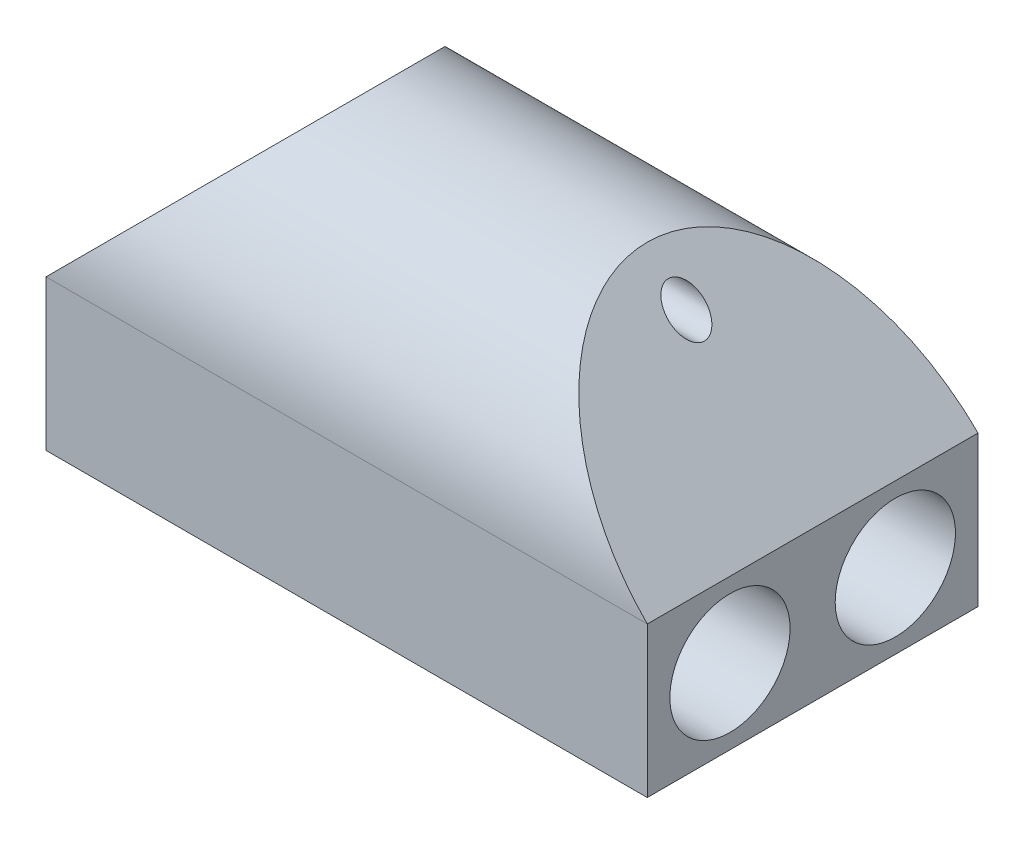
ISO-10303-21;
HEADER;
FILE_DESCRIPTION(('STEP AP214'),'2;1');
FILE_NAME('part.step','',(''),(''),'','','');
FILE_SCHEMA(('AUTOMOTIVE_DESIGN { 1 0 10303 214 1 1 1 1 }'));
ENDSEC;
DATA;
#1=APPLICATION_CONTEXT('core data for automotive mechanical design processes');
#2=APPLICATION_PROTOCOL_DEFINITION('international standard','automotive_design',2000,#1);
#3=PRODUCT_CONTEXT('',#1,'mechanical');
#4=PRODUCT('Part','Part','',(#3));
#5=PRODUCT_RELATED_PRODUCT_CATEGORY('part','',(#4));
#6=PRODUCT_DEFINITION_FORMATION('','',#4);
#7=PRODUCT_DEFINITION_CONTEXT('part definition',#1,'design');
#8=PRODUCT_DEFINITION('design','',#6,#7);
#9=PRODUCT_DEFINITION_SHAPE('','',#8);
#10=(LENGTH_UNIT() NAMED_UNIT(*) SI_UNIT(.MILLI.,.METRE.));
#11=(NAMED_UNIT(*) PLANE_ANGLE_UNIT() SI_UNIT($,.RADIAN.));
#12=(NAMED_UNIT(*) SI_UNIT($,.STERADIAN.) SOLID_ANGLE_UNIT());
#13=UNCERTAINTY_MEASURE_WITH_UNIT(LENGTH_MEASURE(1.E-05),#10,'distance_accuracy_value','');
#14=(GEOMETRIC_REPRESENTATION_CONTEXT(3) GLOBAL_UNCERTAINTY_ASSIGNED_CONTEXT((#13)) GLOBAL_UNIT_ASSIGNED_CONTEXT((#10,
#11,#12)) REPRESENTATION_CONTEXT('',''));
#15=CARTESIAN_POINT('',(0.,0.,0.));
#16=DIRECTION('',(0.,0.,1.));
#17=DIRECTION('',(1.,0.,0.));
#18=AXIS2_PLACEMENT_3D('',#15,#16,#17);
#19=CARTESIAN_POINT('',(0.,6.35,0.));
#20=DIRECTION('',(-1.,0.,0.));
#21=DIRECTION('',(0.,0.,1.));
#22=AXIS2_PLACEMENT_3D('',#19,#20,#21);
#23=PLANE('',#22);
#24=CARTESIAN_POINT('',(0.,3.175,-3.4925));
#25=DIRECTION('',(1.,0.,0.));
#26=DIRECTION('',(0.,0.,-1.));
#27=AXIS2_PLACEMENT_3D('',#24,#25,#26);
#28=CIRCLE('',#27,2.54);
#29=CARTESIAN_POINT('',(0.,3.175,-6.0325));
#30=VERTEX_POINT('',#29);
#31=EDGE_CURVE('E127',#30,#30,#28,.T.);
#32=ORIENTED_EDGE('',*,*,#31,.F.);
#33=EDGE_LOOP('',(#32));
#34=FACE_BOUND('',#33,.T.);
#35=CARTESIAN_POINT('',(0.,3.175,-10.4775));
#36=DIRECTION('',(1.,0.,0.));
#37=DIRECTION('',(0.,0.,1.));
#38=AXIS2_PLACEMENT_3D('',#35,#36,#37);
#39=CIRCLE('',#38,2.54);
#40=CARTESIAN_POINT('',(0.,3.175,-7.9375));
#41=VERTEX_POINT('',#40);
#42=EDGE_CURVE('E121',#41,#41,#39,.T.);
#43=ORIENTED_EDGE('',*,*,#42,.F.);
#44=EDGE_LOOP('',(#43));
#45=FACE_BOUND('',#44,.T.);
#46=DIRECTION('',(0.,-1.,0.));
#47=VECTOR('',#46,1.);
#48=CARTESIAN_POINT('',(0.,6.35,-13.97));
#49=LINE('',#48,#47);
#50=CARTESIAN_POINT('',(0.,6.35,-13.97));
#51=VERTEX_POINT('',#50);
#52=CARTESIAN_POINT('',(0.,0.,-13.97));
#53=VERTEX_POINT('',#52);
#54=EDGE_CURVE('E98',#51,#53,#49,.T.);
#55=ORIENTED_EDGE('',*,*,#54,.F.);
#56=DIRECTION('',(0.,0.,1.));
#57=VECTOR('',#56,1.);
#58=CARTESIAN_POINT('',(0.,6.35,-13.97));
#59=LINE('',#58,#57);
#60=CARTESIAN_POINT('',(0.,6.35,0.));
#61=VERTEX_POINT('',#60);
#62=EDGE_CURVE('E87',#51,#61,#59,.T.);
#63=ORIENTED_EDGE('',*,*,#62,.T.);
#64=DIRECTION('',(0.,-1.,0.));
#65=VECTOR('',#64,1.);
#66=CARTESIAN_POINT('',(0.,6.35,0.));
#67=LINE('',#66,#65);
#68=CARTESIAN_POINT('',(0.,0.,0.));
#69=VERTEX_POINT('',#68);
#70=EDGE_CURVE('E109',#61,#69,#67,.T.);
#71=ORIENTED_EDGE('',*,*,#70,.T.);
#72=DIRECTION('',(0.,0.,-1.));
#73=VECTOR('',#72,1.);
#74=CARTESIAN_POINT('',(0.,0.,0.));
#75=LINE('',#74,#73);
#76=EDGE_CURVE('E91',#69,#53,#75,.T.);
#77=ORIENTED_EDGE('',*,*,#76,.T.);
#78=EDGE_LOOP('',(#55,#63,#71,#77));
#79=FACE_BOUND('',#78,.T.);
#80=ADVANCED_FACE('F35',(#34,#45,#79),#23,.F.);
#81=CARTESIAN_POINT('',(0.,6.35,-13.97));
#82=DIRECTION('',(0.,0.,1.));
#83=DIRECTION('',(1.,0.,0.));
#84=AXIS2_PLACEMENT_3D('',#81,#82,#83);
#85=PLANE('',#84);
#86=DIRECTION('',(-1.,0.,0.));
#87=VECTOR('',#86,1.);
#88=CARTESIAN_POINT('',(0.,0.,-13.97));
#89=LINE('',#88,#87);
#90=CARTESIAN_POINT('',(-25.4,0.,-13.97));
#91=VERTEX_POINT('',#90);
#92=EDGE_CURVE('E113',#53,#91,#89,.T.);
#93=ORIENTED_EDGE('',*,*,#92,.T.);
#94=DIRECTION('',(0.,-1.,0.));
#95=VECTOR('',#94,1.);
#96=CARTESIAN_POINT('',(-25.4,6.35,-13.97));
#97=LINE('',#96,#95);
#98=CARTESIAN_POINT('',(-25.4,6.35,-13.97));
#99=VERTEX_POINT('',#98);
#100=EDGE_CURVE('E100',#99,#91,#97,.T.);
#101=ORIENTED_EDGE('',*,*,#100,.F.);
#102=DIRECTION('',(-1.,0.,0.));
#103=VECTOR('',#102,1.);
#104=CARTESIAN_POINT('',(0.,6.35,-13.97));
#105=LINE('',#104,#103);
#106=EDGE_CURVE('E82',#51,#99,#105,.T.);
#107=ORIENTED_EDGE('',*,*,#106,.F.);
#108=ORIENTED_EDGE('',*,*,#54,.T.);
#109=EDGE_LOOP('',(#93,#101,#107,#108));
#110=FACE_BOUND('',#109,.T.);
#111=ADVANCED_FACE('F97',(#110),#85,.F.);
#112=CARTESIAN_POINT('',(-25.4,6.35,0.));
#113=DIRECTION('',(1.,0.,0.));
#114=DIRECTION('',(0.,0.,-1.));
#115=AXIS2_PLACEMENT_3D('',#112,#113,#114);
#116=PLANE('',#115);
#117=CARTESIAN_POINT('',(-25.4,3.175,-3.4925));
#118=DIRECTION('',(1.,0.,0.));
#119=DIRECTION('',(0.,0.,-1.));
#120=AXIS2_PLACEMENT_3D('',#117,#118,#119);
#121=CIRCLE('',#120,2.54);
#122=CARTESIAN_POINT('',(-25.4,3.175,-6.0325));
#123=VERTEX_POINT('',#122);
#124=EDGE_CURVE('E130',#123,#123,#121,.T.);
#125=ORIENTED_EDGE('',*,*,#124,.T.);
#126=EDGE_LOOP('',(#125));
#127=FACE_BOUND('',#126,.T.);
#128=CARTESIAN_POINT('',(-25.4,3.175,-10.4775));
#129=DIRECTION('',(1.,0.,0.));
#130=DIRECTION('',(0.,0.,1.));
#131=AXIS2_PLACEMENT_3D('',#128,#129,#130);
#132=CIRCLE('',#131,2.54);
#133=CARTESIAN_POINT('',(-25.4,3.175,-7.9375));
#134=VERTEX_POINT('',#133);
#135=EDGE_CURVE('E124',#134,#134,#132,.T.);
#136=ORIENTED_EDGE('',*,*,#135,.T.);
#137=EDGE_LOOP('',(#136));
#138=FACE_BOUND('',#137,.T.);
#139=DIRECTION('',(0.,-1.,0.));
#140=VECTOR('',#139,1.);
#141=CARTESIAN_POINT('',(-25.4,6.35,0.));
#142=LINE('',#141,#140);
#143=CARTESIAN_POINT('',(-25.4,6.35,0.));
#144=VERTEX_POINT('',#143);
#145=CARTESIAN_POINT('',(-25.4,0.,0.));
#146=VERTEX_POINT('',#145);
#147=EDGE_CURVE('E105',#144,#146,#142,.T.);
#148=ORIENTED_EDGE('',*,*,#147,.F.);
#149=DIRECTION('',(0.,0.,1.));
#150=VECTOR('',#149,1.);
#151=CARTESIAN_POINT('',(-25.4,6.35,-13.97));
#152=LINE('',#151,#150);
#153=EDGE_CURVE('E92',#99,#144,#152,.T.);
#154=ORIENTED_EDGE('',*,*,#153,.F.);
#155=ORIENTED_EDGE('',*,*,#100,.T.);
#156=DIRECTION('',(0.,0.,1.));
#157=VECTOR('',#156,1.);
#158=CARTESIAN_POINT('',(-25.4,0.,0.));
#159=LINE('',#158,#157);
#160=EDGE_CURVE('E58',#91,#146,#159,.T.);
#161=ORIENTED_EDGE('',*,*,#160,.T.);
#162=EDGE_LOOP('',(#148,#154,#155,#161));
#163=FACE_BOUND('',#162,.T.);
#164=ADVANCED_FACE('F150',(#127,#138,#163),#116,.F.);
#165=CARTESIAN_POINT('',(0.,6.35,0.));
#166=DIRECTION('',(0.,0.,-1.));
#167=DIRECTION('',(-1.,0.,0.));
#168=AXIS2_PLACEMENT_3D('',#165,#166,#167);
#169=PLANE('',#168);
#170=DIRECTION('',(1.,0.,0.));
#171=VECTOR('',#170,1.);
#172=CARTESIAN_POINT('',(0.,0.,0.));
#173=LINE('',#172,#171);
#174=EDGE_CURVE('E50',#146,#69,#173,.T.);
#175=ORIENTED_EDGE('',*,*,#174,.T.);
#176=ORIENTED_EDGE('',*,*,#70,.F.);
#177=DIRECTION('',(1.,0.,0.));
#178=VECTOR('',#177,1.);
#179=CARTESIAN_POINT('',(0.,6.35,0.));
#180=LINE('',#179,#178);
#181=EDGE_CURVE('E84',#144,#61,#180,.T.);
#182=ORIENTED_EDGE('',*,*,#181,.F.);
#183=ORIENTED_EDGE('',*,*,#147,.T.);
#184=EDGE_LOOP('',(#175,#176,#182,#183));
#185=FACE_BOUND('',#184,.T.);
#186=ADVANCED_FACE('F151',(#185),#169,.F.);
#187=CARTESIAN_POINT('',(0.,0.,0.));
#188=DIRECTION('',(0.,1.,0.));
#189=DIRECTION('',(0.,0.,1.));
#190=AXIS2_PLACEMENT_3D('',#187,#188,#189);
#191=PLANE('',#190);
#192=ORIENTED_EDGE('',*,*,#76,.F.);
#193=ORIENTED_EDGE('',*,*,#174,.F.);
#194=ORIENTED_EDGE('',*,*,#160,.F.);
#195=ORIENTED_EDGE('',*,*,#92,.F.);
#196=EDGE_LOOP('',(#192,#193,#194,#195));
#197=FACE_BOUND('',#196,.T.);
#198=ADVANCED_FACE('F153',(#197),#191,.F.);
#199=CARTESIAN_POINT('',(-41.018934822836,6.35,-6.985));
#200=DIRECTION('',(1.,0.,0.));
#201=DIRECTION('',(0.,0.,-1.));
#202=AXIS2_PLACEMENT_3D('',#199,#200,#201);
#203=CYLINDRICAL_SURFACE('',#202,6.985);
#204=CARTESIAN_POINT('',(0.,6.35,-6.985));
#205=DIRECTION('',(-0.707106781186551,-0.707106781186544,0.));
#206=DIRECTION('',(0.707106781186544,-0.707106781186551,0.));
#207=AXIS2_PLACEMENT_3D('',#204,#205,#206);
#208=ELLIPSE('',#207,9.87828173317602,6.985);
#209=EDGE_CURVE('E11',#51,#61,#208,.F.);
#210=ORIENTED_EDGE('',*,*,#209,.F.);
#211=ORIENTED_EDGE('',*,*,#106,.T.);
#212=CARTESIAN_POINT('',(-25.4,6.35,-6.985));
#213=DIRECTION('',(0.707106781186551,-0.707106781186544,0.));
#214=DIRECTION('',(0.707106781186544,0.707106781186551,0.));
#215=AXIS2_PLACEMENT_3D('',#212,#213,#214);
#216=ELLIPSE('',#215,9.87828173317602,6.985);
#217=EDGE_CURVE('E43',#144,#99,#216,.F.);
#218=ORIENTED_EDGE('',*,*,#217,.F.);
#219=ORIENTED_EDGE('',*,*,#181,.T.);
#220=EDGE_LOOP('',(#210,#211,#218,#219));
#221=FACE_BOUND('',#220,.T.);
#222=ADVANCED_FACE('F79',(#221),#203,.T.);
#223=CARTESIAN_POINT('',(-18.4150000000001,13.335,-13.97));
#224=DIRECTION('',(0.707106781186551,-0.707106781186544,0.));
#225=DIRECTION('',(0.707106781186544,0.707106781186551,0.));
#226=AXIS2_PLACEMENT_3D('',#223,#224,#225);
#227=PLANE('',#226);
#228=CARTESIAN_POINT('',(-20.0660000000001,11.684,-6.985));
#229=DIRECTION('',(0.707106781186551,-0.707106781186544,0.));
#230=DIRECTION('',(0.707106781186544,0.707106781186551,0.));
#231=AXIS2_PLACEMENT_3D('',#228,#229,#230);
#232=ELLIPSE('',#231,1.07763073452829,0.761999999999999);
#233=CARTESIAN_POINT('',(-19.3040000000001,12.446,-6.985));
#234=VERTEX_POINT('',#233);
#235=EDGE_CURVE('E117',#234,#234,#232,.T.);
#236=ORIENTED_EDGE('',*,*,#235,.T.);
#237=EDGE_LOOP('',(#236));
#238=FACE_BOUND('',#237,.T.);
#239=ORIENTED_EDGE('',*,*,#217,.T.);
#240=ORIENTED_EDGE('',*,*,#153,.T.);
#241=EDGE_LOOP('',(#239,#240));
#242=FACE_BOUND('',#241,.T.);
#243=ADVANCED_FACE('F145',(#238,#242),#227,.F.);
#244=CARTESIAN_POINT('',(-6.98499999999993,13.335,-13.97));
#245=DIRECTION('',(-0.707106781186551,-0.707106781186544,0.));
#246=DIRECTION('',(0.707106781186544,-0.707106781186551,0.));
#247=AXIS2_PLACEMENT_3D('',#244,#245,#246);
#248=PLANE('',#247);
#249=CARTESIAN_POINT('',(-5.33399999999994,11.684,-6.985));
#250=DIRECTION('',(-0.707106781186551,-0.707106781186544,0.));
#251=DIRECTION('',(0.707106781186544,-0.707106781186551,0.));
#252=AXIS2_PLACEMENT_3D('',#249,#250,#251);
#253=ELLIPSE('',#252,1.07763073452829,0.761999999999999);
#254=CARTESIAN_POINT('',(-4.57199999999995,10.922,-6.985));
#255=VERTEX_POINT('',#254);
#256=EDGE_CURVE('E38',#255,#255,#253,.T.);
#257=ORIENTED_EDGE('',*,*,#256,.T.);
#258=EDGE_LOOP('',(#257));
#259=FACE_BOUND('',#258,.T.);
#260=ORIENTED_EDGE('',*,*,#62,.F.);
#261=ORIENTED_EDGE('',*,*,#209,.T.);
#262=EDGE_LOOP('',(#260,#261));
#263=FACE_BOUND('',#262,.T.);
#264=ADVANCED_FACE('F88',(#259,#263),#248,.F.);
#265=CARTESIAN_POINT('',(-25.4,11.684,-6.985));
#266=DIRECTION('',(1.,0.,0.));
#267=DIRECTION('',(0.,0.,-1.));
#268=AXIS2_PLACEMENT_3D('',#265,#266,#267);
#269=CYLINDRICAL_SURFACE('',#268,0.761999999999999);
#270=ORIENTED_EDGE('',*,*,#256,.F.);
#271=EDGE_LOOP('',(#270));
#272=FACE_BOUND('',#271,.T.);
#273=ORIENTED_EDGE('',*,*,#235,.F.);
#274=EDGE_LOOP('',(#273));
#275=FACE_BOUND('',#274,.T.);
#276=ADVANCED_FACE('F138',(#272,#275),#269,.F.);
#277=CARTESIAN_POINT('',(-25.4,3.175,-10.4775));
#278=DIRECTION('',(1.,0.,0.));
#279=DIRECTION('',(0.,0.,-1.));
#280=AXIS2_PLACEMENT_3D('',#277,#278,#279);
#281=CYLINDRICAL_SURFACE('',#280,2.54);
#282=ORIENTED_EDGE('',*,*,#135,.F.);
#283=EDGE_LOOP('',(#282));
#284=FACE_BOUND('',#283,.T.);
#285=ORIENTED_EDGE('',*,*,#42,.T.);
#286=EDGE_LOOP('',(#285));
#287=FACE_BOUND('',#286,.T.);
#288=ADVANCED_FACE('F141',(#284,#287),#281,.F.);
#289=CARTESIAN_POINT('',(-25.4,3.175,-3.4925));
#290=DIRECTION('',(1.,0.,0.));
#291=DIRECTION('',(0.,0.,-1.));
#292=AXIS2_PLACEMENT_3D('',#289,#290,#291);
#293=CYLINDRICAL_SURFACE('',#292,2.54);
#294=ORIENTED_EDGE('',*,*,#124,.F.);
#295=EDGE_LOOP('',(#294));
#296=FACE_BOUND('',#295,.T.);
#297=ORIENTED_EDGE('',*,*,#31,.T.);
#298=EDGE_LOOP('',(#297));
#299=FACE_BOUND('',#298,.T.);
#300=ADVANCED_FACE('F172',(#296,#299),#293,.F.);
#301=CLOSED_SHELL('',(#80,#111,#164,#186,#198,#222,#243,#264,#276,#288,#300));
#302=MANIFOLD_SOLID_BREP('B2',#301);
#303=ADVANCED_BREP_SHAPE_REPRESENTATION('',(#18,#302),#14);
#304=SHAPE_DEFINITION_REPRESENTATION(#9,#303);
ENDSEC;
END-ISO-10303-21;
